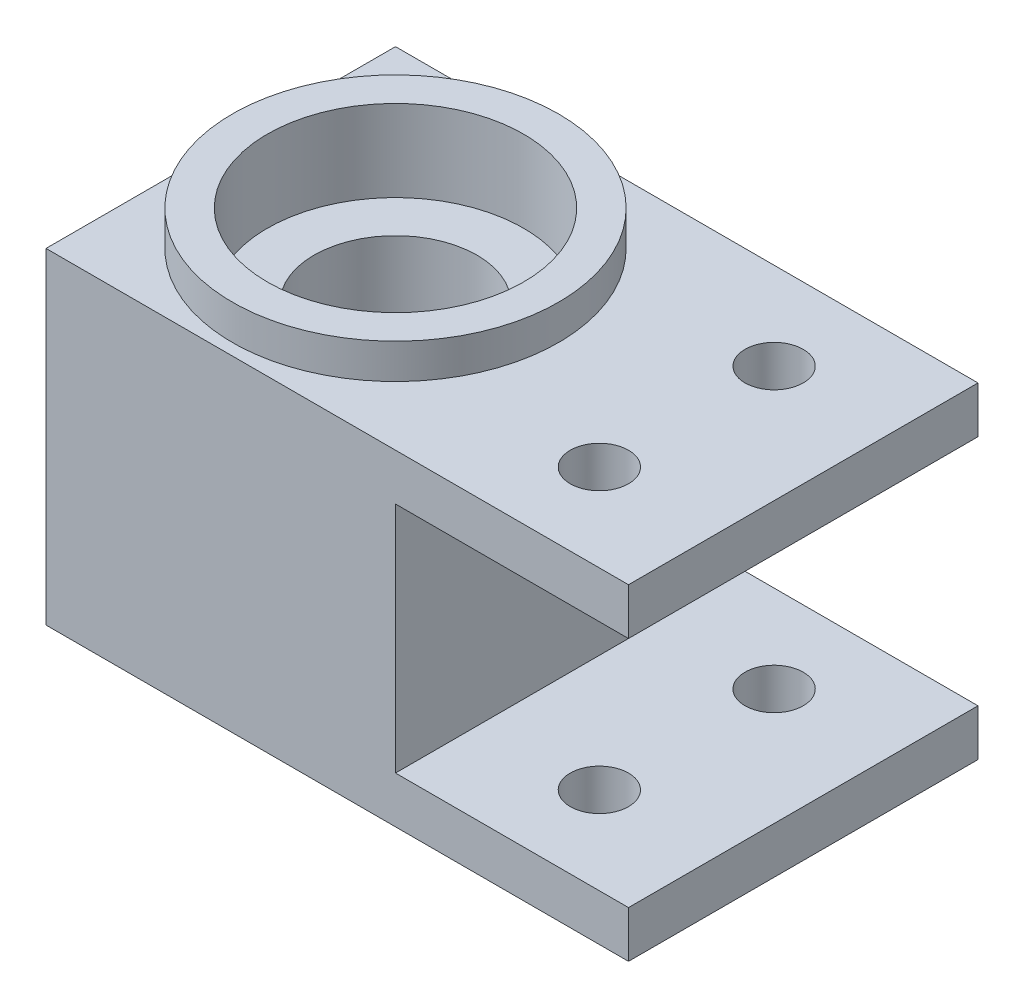
ISO-10303-21;
HEADER;
FILE_DESCRIPTION(('STEP AP214'),'2;1');
FILE_NAME('part.step','',(''),(''),'','','');
FILE_SCHEMA(('AUTOMOTIVE_DESIGN { 1 0 10303 214 1 1 1 1 }'));
ENDSEC;
DATA;
#1=APPLICATION_CONTEXT('core data for automotive mechanical design processes');
#2=APPLICATION_PROTOCOL_DEFINITION('international standard','automotive_design',2000,#1);
#3=PRODUCT_CONTEXT('',#1,'mechanical');
#4=PRODUCT('Part','Part','',(#3));
#5=PRODUCT_RELATED_PRODUCT_CATEGORY('part','',(#4));
#6=PRODUCT_DEFINITION_FORMATION('','',#4);
#7=PRODUCT_DEFINITION_CONTEXT('part definition',#1,'design');
#8=PRODUCT_DEFINITION('design','',#6,#7);
#9=PRODUCT_DEFINITION_SHAPE('','',#8);
#10=(LENGTH_UNIT() NAMED_UNIT(*) SI_UNIT(.MILLI.,.METRE.));
#11=(NAMED_UNIT(*) PLANE_ANGLE_UNIT() SI_UNIT($,.RADIAN.));
#12=(NAMED_UNIT(*) SI_UNIT($,.STERADIAN.) SOLID_ANGLE_UNIT());
#13=UNCERTAINTY_MEASURE_WITH_UNIT(LENGTH_MEASURE(1.E-05),#10,'distance_accuracy_value','');
#14=(GEOMETRIC_REPRESENTATION_CONTEXT(3) GLOBAL_UNCERTAINTY_ASSIGNED_CONTEXT((#13)) GLOBAL_UNIT_ASSIGNED_CONTEXT((#10,
#11,#12)) REPRESENTATION_CONTEXT('',''));
#15=CARTESIAN_POINT('',(0.,0.,0.));
#16=DIRECTION('',(0.,0.,1.));
#17=DIRECTION('',(1.,0.,0.));
#18=AXIS2_PLACEMENT_3D('',#15,#16,#17);
#19=CARTESIAN_POINT('',(10.,-14.,30.));
#20=DIRECTION('',(1.,0.,0.));
#21=DIRECTION('',(0.,0.,-1.));
#22=AXIS2_PLACEMENT_3D('',#19,#20,#21);
#23=PLANE('',#22);
#24=DIRECTION('',(0.,0.,-1.));
#25=VECTOR('',#24,1.);
#26=CARTESIAN_POINT('',(10.,10.,30.));
#27=LINE('',#26,#25);
#28=CARTESIAN_POINT('',(10.,10.,30.));
#29=VERTEX_POINT('',#28);
#30=CARTESIAN_POINT('',(10.,10.,0.));
#31=VERTEX_POINT('',#30);
#32=EDGE_CURVE('E115',#29,#31,#27,.T.);
#33=ORIENTED_EDGE('',*,*,#32,.T.);
#34=DIRECTION('',(0.,1.,0.));
#35=VECTOR('',#34,1.);
#36=CARTESIAN_POINT('',(10.,-14.,0.));
#37=LINE('',#36,#35);
#38=CARTESIAN_POINT('',(10.,14.,0.));
#39=VERTEX_POINT('',#38);
#40=EDGE_CURVE('E142',#31,#39,#37,.T.);
#41=ORIENTED_EDGE('',*,*,#40,.T.);
#42=DIRECTION('',(0.,0.,-1.));
#43=VECTOR('',#42,1.);
#44=CARTESIAN_POINT('',(10.,14.,30.));
#45=LINE('',#44,#43);
#46=CARTESIAN_POINT('',(10.,14.,30.));
#47=VERTEX_POINT('',#46);
#48=EDGE_CURVE('E132',#47,#39,#45,.T.);
#49=ORIENTED_EDGE('',*,*,#48,.F.);
#50=DIRECTION('',(0.,1.,0.));
#51=VECTOR('',#50,1.);
#52=CARTESIAN_POINT('',(10.,-14.,30.));
#53=LINE('',#52,#51);
#54=EDGE_CURVE('E48',#29,#47,#53,.T.);
#55=ORIENTED_EDGE('',*,*,#54,.F.);
#56=EDGE_LOOP('',(#33,#41,#49,#55));
#57=FACE_BOUND('',#56,.T.);
#58=ADVANCED_FACE('F39',(#57),#23,.T.);
#59=DIRECTION('',(0.,0.,-1.));
#60=VECTOR('',#59,1.);
#61=CARTESIAN_POINT('',(10.,-10.,30.));
#62=LINE('',#61,#60);
#63=CARTESIAN_POINT('',(10.,-10.,30.));
#64=VERTEX_POINT('',#63);
#65=CARTESIAN_POINT('',(10.,-10.,0.));
#66=VERTEX_POINT('',#65);
#67=EDGE_CURVE('E56',#64,#66,#62,.T.);
#68=ORIENTED_EDGE('',*,*,#67,.F.);
#69=CARTESIAN_POINT('',(10.,-14.,30.));
#70=VERTEX_POINT('',#69);
#71=EDGE_CURVE('E11',#70,#64,#53,.T.);
#72=ORIENTED_EDGE('',*,*,#71,.F.);
#73=DIRECTION('',(0.,0.,-1.));
#74=VECTOR('',#73,1.);
#75=CARTESIAN_POINT('',(10.,-14.,30.));
#76=LINE('',#75,#74);
#77=CARTESIAN_POINT('',(10.,-14.,0.));
#78=VERTEX_POINT('',#77);
#79=EDGE_CURVE('E160',#70,#78,#76,.T.);
#80=ORIENTED_EDGE('',*,*,#79,.T.);
#81=EDGE_CURVE('E43',#78,#66,#37,.T.);
#82=ORIENTED_EDGE('',*,*,#81,.T.);
#83=EDGE_LOOP('',(#68,#72,#80,#82));
#84=FACE_BOUND('',#83,.T.);
#85=ADVANCED_FACE('F41',(#84),#23,.T.);
#86=CARTESIAN_POINT('',(-40.,-14.,30.));
#87=DIRECTION('',(0.,0.,1.));
#88=DIRECTION('',(1.,0.,0.));
#89=AXIS2_PLACEMENT_3D('',#86,#87,#88);
#90=PLANE('',#89);
#91=DIRECTION('',(1.,0.,0.));
#92=VECTOR('',#91,1.);
#93=CARTESIAN_POINT('',(-10.,10.,30.));
#94=LINE('',#93,#92);
#95=CARTESIAN_POINT('',(-10.,10.,30.));
#96=VERTEX_POINT('',#95);
#97=EDGE_CURVE('E117',#96,#29,#94,.T.);
#98=ORIENTED_EDGE('',*,*,#97,.T.);
#99=ORIENTED_EDGE('',*,*,#54,.T.);
#100=DIRECTION('',(1.,0.,0.));
#101=VECTOR('',#100,1.);
#102=CARTESIAN_POINT('',(-40.,14.,30.));
#103=LINE('',#102,#101);
#104=CARTESIAN_POINT('',(-40.,14.,30.));
#105=VERTEX_POINT('',#104);
#106=EDGE_CURVE('E138',#105,#47,#103,.T.);
#107=ORIENTED_EDGE('',*,*,#106,.F.);
#108=DIRECTION('',(0.,1.,0.));
#109=VECTOR('',#108,1.);
#110=CARTESIAN_POINT('',(-40.,-14.,30.));
#111=LINE('',#110,#109);
#112=CARTESIAN_POINT('',(-40.,-14.,30.));
#113=VERTEX_POINT('',#112);
#114=EDGE_CURVE('E134',#113,#105,#111,.T.);
#115=ORIENTED_EDGE('',*,*,#114,.F.);
#116=DIRECTION('',(1.,0.,0.));
#117=VECTOR('',#116,1.);
#118=CARTESIAN_POINT('',(-40.,-14.,30.));
#119=LINE('',#118,#117);
#120=EDGE_CURVE('E143',#113,#70,#119,.T.);
#121=ORIENTED_EDGE('',*,*,#120,.T.);
#122=ORIENTED_EDGE('',*,*,#71,.T.);
#123=DIRECTION('',(-1.,0.,0.));
#124=VECTOR('',#123,1.);
#125=CARTESIAN_POINT('',(10.,-10.,30.));
#126=LINE('',#125,#124);
#127=CARTESIAN_POINT('',(-10.,-10.,30.));
#128=VERTEX_POINT('',#127);
#129=EDGE_CURVE('E128',#64,#128,#126,.T.);
#130=ORIENTED_EDGE('',*,*,#129,.T.);
#131=DIRECTION('',(0.,1.,0.));
#132=VECTOR('',#131,1.);
#133=CARTESIAN_POINT('',(-10.,-10.,30.));
#134=LINE('',#133,#132);
#135=EDGE_CURVE('E123',#128,#96,#134,.T.);
#136=ORIENTED_EDGE('',*,*,#135,.T.);
#137=EDGE_LOOP('',(#98,#99,#107,#115,#121,#122,#130,#136));
#138=FACE_BOUND('',#137,.T.);
#139=ADVANCED_FACE('F125',(#138),#90,.T.);
#140=CARTESIAN_POINT('',(-40.,-14.,0.));
#141=DIRECTION('',(-1.,0.,0.));
#142=DIRECTION('',(0.,0.,1.));
#143=AXIS2_PLACEMENT_3D('',#140,#141,#142);
#144=PLANE('',#143);
#145=DIRECTION('',(0.,0.,1.));
#146=VECTOR('',#145,1.);
#147=CARTESIAN_POINT('',(-40.,14.,0.));
#148=LINE('',#147,#146);
#149=CARTESIAN_POINT('',(-40.,14.,0.));
#150=VERTEX_POINT('',#149);
#151=EDGE_CURVE('E157',#150,#105,#148,.T.);
#152=ORIENTED_EDGE('',*,*,#151,.F.);
#153=DIRECTION('',(0.,1.,0.));
#154=VECTOR('',#153,1.);
#155=CARTESIAN_POINT('',(-40.,-14.,0.));
#156=LINE('',#155,#154);
#157=CARTESIAN_POINT('',(-40.,-14.,0.));
#158=VERTEX_POINT('',#157);
#159=EDGE_CURVE('E135',#158,#150,#156,.T.);
#160=ORIENTED_EDGE('',*,*,#159,.F.);
#161=DIRECTION('',(0.,0.,1.));
#162=VECTOR('',#161,1.);
#163=CARTESIAN_POINT('',(-40.,-14.,0.));
#164=LINE('',#163,#162);
#165=EDGE_CURVE('E145',#158,#113,#164,.T.);
#166=ORIENTED_EDGE('',*,*,#165,.T.);
#167=ORIENTED_EDGE('',*,*,#114,.T.);
#168=EDGE_LOOP('',(#152,#160,#166,#167));
#169=FACE_BOUND('',#168,.T.);
#170=ADVANCED_FACE('F239',(#169),#144,.T.);
#171=CARTESIAN_POINT('',(10.,-14.,0.));
#172=DIRECTION('',(0.,0.,-1.));
#173=DIRECTION('',(-1.,0.,0.));
#174=AXIS2_PLACEMENT_3D('',#171,#172,#173);
#175=PLANE('',#174);
#176=DIRECTION('',(1.,0.,0.));
#177=VECTOR('',#176,1.);
#178=CARTESIAN_POINT('',(-10.,10.,0.));
#179=LINE('',#178,#177);
#180=CARTESIAN_POINT('',(-10.,10.,0.));
#181=VERTEX_POINT('',#180);
#182=EDGE_CURVE('E120',#181,#31,#179,.T.);
#183=ORIENTED_EDGE('',*,*,#182,.F.);
#184=DIRECTION('',(0.,1.,0.));
#185=VECTOR('',#184,1.);
#186=CARTESIAN_POINT('',(-10.,-10.,0.));
#187=LINE('',#186,#185);
#188=CARTESIAN_POINT('',(-10.,-10.,0.));
#189=VERTEX_POINT('',#188);
#190=EDGE_CURVE('E129',#189,#181,#187,.T.);
#191=ORIENTED_EDGE('',*,*,#190,.F.);
#192=DIRECTION('',(-1.,0.,0.));
#193=VECTOR('',#192,1.);
#194=CARTESIAN_POINT('',(10.,-10.,0.));
#195=LINE('',#194,#193);
#196=EDGE_CURVE('E169',#66,#189,#195,.T.);
#197=ORIENTED_EDGE('',*,*,#196,.F.);
#198=ORIENTED_EDGE('',*,*,#81,.F.);
#199=DIRECTION('',(-1.,0.,0.));
#200=VECTOR('',#199,1.);
#201=CARTESIAN_POINT('',(10.,-14.,0.));
#202=LINE('',#201,#200);
#203=EDGE_CURVE('E149',#78,#158,#202,.T.);
#204=ORIENTED_EDGE('',*,*,#203,.T.);
#205=ORIENTED_EDGE('',*,*,#159,.T.);
#206=DIRECTION('',(-1.,0.,0.));
#207=VECTOR('',#206,1.);
#208=CARTESIAN_POINT('',(10.,14.,0.));
#209=LINE('',#208,#207);
#210=EDGE_CURVE('E154',#39,#150,#209,.T.);
#211=ORIENTED_EDGE('',*,*,#210,.F.);
#212=ORIENTED_EDGE('',*,*,#40,.F.);
#213=EDGE_LOOP('',(#183,#191,#197,#198,#204,#205,#211,#212));
#214=FACE_BOUND('',#213,.T.);
#215=ADVANCED_FACE('F230',(#214),#175,.T.);
#216=CARTESIAN_POINT('',(0.,-14.,0.));
#217=DIRECTION('',(0.,1.,0.));
#218=DIRECTION('',(0.,0.,1.));
#219=AXIS2_PLACEMENT_3D('',#216,#217,#218);
#220=PLANE('',#219);
#221=CARTESIAN_POINT('',(0.,-14.,7.5));
#222=DIRECTION('',(0.,-1.,0.));
#223=DIRECTION('',(0.,0.,-1.));
#224=AXIS2_PLACEMENT_3D('',#221,#222,#223);
#225=CIRCLE('',#224,2.49999999999999);
#226=CARTESIAN_POINT('',(0.,-14.,5.00000000000001));
#227=VERTEX_POINT('',#226);
#228=EDGE_CURVE('E219',#227,#227,#225,.T.);
#229=ORIENTED_EDGE('',*,*,#228,.F.);
#230=EDGE_LOOP('',(#229));
#231=FACE_BOUND('',#230,.T.);
#232=CARTESIAN_POINT('',(0.,-14.,22.5));
#233=DIRECTION('',(0.,-1.,0.));
#234=DIRECTION('',(0.,0.,-1.));
#235=AXIS2_PLACEMENT_3D('',#232,#233,#234);
#236=CIRCLE('',#235,2.49999999999999);
#237=CARTESIAN_POINT('',(0.,-14.,20.));
#238=VERTEX_POINT('',#237);
#239=EDGE_CURVE('E213',#238,#238,#236,.T.);
#240=ORIENTED_EDGE('',*,*,#239,.F.);
#241=EDGE_LOOP('',(#240));
#242=FACE_BOUND('',#241,.T.);
#243=CARTESIAN_POINT('',(-25.,-14.,15.));
#244=DIRECTION('',(0.,1.,0.));
#245=DIRECTION('',(0.,0.,1.));
#246=AXIS2_PLACEMENT_3D('',#243,#244,#245);
#247=CIRCLE('',#246,11.);
#248=CARTESIAN_POINT('',(-25.,-14.,26.));
#249=VERTEX_POINT('',#248);
#250=EDGE_CURVE('E180',#249,#249,#247,.T.);
#251=ORIENTED_EDGE('',*,*,#250,.T.);
#252=EDGE_LOOP('',(#251));
#253=FACE_BOUND('',#252,.T.);
#254=ORIENTED_EDGE('',*,*,#79,.F.);
#255=ORIENTED_EDGE('',*,*,#120,.F.);
#256=ORIENTED_EDGE('',*,*,#165,.F.);
#257=ORIENTED_EDGE('',*,*,#203,.F.);
#258=EDGE_LOOP('',(#254,#255,#256,#257));
#259=FACE_BOUND('',#258,.T.);
#260=ADVANCED_FACE('F226',(#231,#242,#253,#259),#220,.F.);
#261=CARTESIAN_POINT('',(0.,14.,0.));
#262=DIRECTION('',(0.,1.,0.));
#263=DIRECTION('',(0.,0.,1.));
#264=AXIS2_PLACEMENT_3D('',#261,#262,#263);
#265=PLANE('',#264);
#266=CARTESIAN_POINT('',(0.,14.,7.5));
#267=DIRECTION('',(0.,1.,0.));
#268=DIRECTION('',(0.,0.,1.));
#269=AXIS2_PLACEMENT_3D('',#266,#267,#268);
#270=CIRCLE('',#269,2.49999999999999);
#271=CARTESIAN_POINT('',(0.,14.,9.99999999999999));
#272=VERTEX_POINT('',#271);
#273=EDGE_CURVE('E204',#272,#272,#270,.T.);
#274=ORIENTED_EDGE('',*,*,#273,.F.);
#275=EDGE_LOOP('',(#274));
#276=FACE_BOUND('',#275,.T.);
#277=CARTESIAN_POINT('',(0.,14.,22.5));
#278=DIRECTION('',(0.,1.,0.));
#279=DIRECTION('',(0.,0.,1.));
#280=AXIS2_PLACEMENT_3D('',#277,#278,#279);
#281=CIRCLE('',#280,2.49999999999999);
#282=CARTESIAN_POINT('',(0.,14.,25.));
#283=VERTEX_POINT('',#282);
#284=EDGE_CURVE('E198',#283,#283,#281,.T.);
#285=ORIENTED_EDGE('',*,*,#284,.F.);
#286=EDGE_LOOP('',(#285));
#287=FACE_BOUND('',#286,.T.);
#288=CARTESIAN_POINT('',(-25.,14.,15.));
#289=DIRECTION('',(0.,-1.,0.));
#290=DIRECTION('',(0.,0.,-1.));
#291=AXIS2_PLACEMENT_3D('',#288,#289,#290);
#292=CIRCLE('',#291,14.);
#293=CARTESIAN_POINT('',(-25.,14.,1.));
#294=VERTEX_POINT('',#293);
#295=EDGE_CURVE('E177',#294,#294,#292,.T.);
#296=ORIENTED_EDGE('',*,*,#295,.T.);
#297=EDGE_LOOP('',(#296));
#298=FACE_BOUND('',#297,.T.);
#299=ORIENTED_EDGE('',*,*,#48,.T.);
#300=ORIENTED_EDGE('',*,*,#210,.T.);
#301=ORIENTED_EDGE('',*,*,#151,.T.);
#302=ORIENTED_EDGE('',*,*,#106,.T.);
#303=EDGE_LOOP('',(#299,#300,#301,#302));
#304=FACE_BOUND('',#303,.T.);
#305=ADVANCED_FACE('F229',(#276,#287,#298,#304),#265,.T.);
#306=CARTESIAN_POINT('',(-10.,10.,30.));
#307=DIRECTION('',(0.,1.,0.));
#308=DIRECTION('',(0.,0.,1.));
#309=AXIS2_PLACEMENT_3D('',#306,#307,#308);
#310=PLANE('',#309);
#311=CARTESIAN_POINT('',(0.,10.,7.5));
#312=DIRECTION('',(0.,-1.,0.));
#313=DIRECTION('',(0.,0.,-1.));
#314=AXIS2_PLACEMENT_3D('',#311,#312,#313);
#315=CIRCLE('',#314,2.49999999999999);
#316=CARTESIAN_POINT('',(0.,10.,5.00000000000001));
#317=VERTEX_POINT('',#316);
#318=EDGE_CURVE('E207',#317,#317,#315,.T.);
#319=ORIENTED_EDGE('',*,*,#318,.F.);
#320=EDGE_LOOP('',(#319));
#321=FACE_BOUND('',#320,.T.);
#322=CARTESIAN_POINT('',(0.,10.,22.5));
#323=DIRECTION('',(0.,-1.,0.));
#324=DIRECTION('',(0.,0.,-1.));
#325=AXIS2_PLACEMENT_3D('',#322,#323,#324);
#326=CIRCLE('',#325,2.49999999999999);
#327=CARTESIAN_POINT('',(0.,10.,20.));
#328=VERTEX_POINT('',#327);
#329=EDGE_CURVE('E201',#328,#328,#326,.T.);
#330=ORIENTED_EDGE('',*,*,#329,.F.);
#331=EDGE_LOOP('',(#330));
#332=FACE_BOUND('',#331,.T.);
#333=ORIENTED_EDGE('',*,*,#182,.T.);
#334=ORIENTED_EDGE('',*,*,#32,.F.);
#335=ORIENTED_EDGE('',*,*,#97,.F.);
#336=DIRECTION('',(0.,0.,-1.));
#337=VECTOR('',#336,1.);
#338=CARTESIAN_POINT('',(-10.,10.,30.));
#339=LINE('',#338,#337);
#340=EDGE_CURVE('E155',#96,#181,#339,.T.);
#341=ORIENTED_EDGE('',*,*,#340,.T.);
#342=EDGE_LOOP('',(#333,#334,#335,#341));
#343=FACE_BOUND('',#342,.T.);
#344=ADVANCED_FACE('F116',(#321,#332,#343),#310,.F.);
#345=CARTESIAN_POINT('',(-10.,-10.,30.));
#346=DIRECTION('',(-1.,0.,0.));
#347=DIRECTION('',(0.,0.,1.));
#348=AXIS2_PLACEMENT_3D('',#345,#346,#347);
#349=PLANE('',#348);
#350=ORIENTED_EDGE('',*,*,#190,.T.);
#351=ORIENTED_EDGE('',*,*,#340,.F.);
#352=ORIENTED_EDGE('',*,*,#135,.F.);
#353=DIRECTION('',(0.,0.,-1.));
#354=VECTOR('',#353,1.);
#355=CARTESIAN_POINT('',(-10.,-10.,30.));
#356=LINE('',#355,#354);
#357=EDGE_CURVE('E164',#128,#189,#356,.T.);
#358=ORIENTED_EDGE('',*,*,#357,.T.);
#359=EDGE_LOOP('',(#350,#351,#352,#358));
#360=FACE_BOUND('',#359,.T.);
#361=ADVANCED_FACE('F255',(#360),#349,.F.);
#362=CARTESIAN_POINT('',(10.,-10.,30.));
#363=DIRECTION('',(0.,-1.,0.));
#364=DIRECTION('',(0.,0.,-1.));
#365=AXIS2_PLACEMENT_3D('',#362,#363,#364);
#366=PLANE('',#365);
#367=CARTESIAN_POINT('',(0.,-10.,7.5));
#368=DIRECTION('',(0.,-1.,0.));
#369=DIRECTION('',(0.,0.,-1.));
#370=AXIS2_PLACEMENT_3D('',#367,#368,#369);
#371=CIRCLE('',#370,2.49999999999999);
#372=CARTESIAN_POINT('',(0.,-10.,5.00000000000001));
#373=VERTEX_POINT('',#372);
#374=EDGE_CURVE('E216',#373,#373,#371,.T.);
#375=ORIENTED_EDGE('',*,*,#374,.T.);
#376=EDGE_LOOP('',(#375));
#377=FACE_BOUND('',#376,.T.);
#378=CARTESIAN_POINT('',(0.,-10.,22.5));
#379=DIRECTION('',(0.,-1.,0.));
#380=DIRECTION('',(0.,0.,-1.));
#381=AXIS2_PLACEMENT_3D('',#378,#379,#380);
#382=CIRCLE('',#381,2.49999999999999);
#383=CARTESIAN_POINT('',(0.,-10.,20.));
#384=VERTEX_POINT('',#383);
#385=EDGE_CURVE('E210',#384,#384,#382,.T.);
#386=ORIENTED_EDGE('',*,*,#385,.T.);
#387=EDGE_LOOP('',(#386));
#388=FACE_BOUND('',#387,.T.);
#389=ORIENTED_EDGE('',*,*,#196,.T.);
#390=ORIENTED_EDGE('',*,*,#357,.F.);
#391=ORIENTED_EDGE('',*,*,#129,.F.);
#392=ORIENTED_EDGE('',*,*,#67,.T.);
#393=EDGE_LOOP('',(#389,#390,#391,#392));
#394=FACE_BOUND('',#393,.T.);
#395=ADVANCED_FACE('F253',(#377,#388,#394),#366,.F.);
#396=CARTESIAN_POINT('',(-25.,17.,15.));
#397=DIRECTION('',(0.,-1.,0.));
#398=DIRECTION('',(0.,0.,-1.));
#399=AXIS2_PLACEMENT_3D('',#396,#397,#398);
#400=CYLINDRICAL_SURFACE('',#399,14.);
#401=CARTESIAN_POINT('',(-25.,17.,15.));
#402=DIRECTION('',(0.,-1.,0.));
#403=DIRECTION('',(0.,0.,-1.));
#404=AXIS2_PLACEMENT_3D('',#401,#402,#403);
#405=CIRCLE('',#404,14.);
#406=CARTESIAN_POINT('',(-25.,17.,0.999999999999999));
#407=VERTEX_POINT('',#406);
#408=EDGE_CURVE('E172',#407,#407,#405,.T.);
#409=ORIENTED_EDGE('',*,*,#408,.T.);
#410=EDGE_LOOP('',(#409));
#411=FACE_BOUND('',#410,.T.);
#412=ORIENTED_EDGE('',*,*,#295,.F.);
#413=EDGE_LOOP('',(#412));
#414=FACE_BOUND('',#413,.T.);
#415=ADVANCED_FACE('F262',(#411,#414),#400,.T.);
#416=CARTESIAN_POINT('',(-11.,17.,15.));
#417=DIRECTION('',(0.,1.,0.));
#418=DIRECTION('',(0.,0.,1.));
#419=AXIS2_PLACEMENT_3D('',#416,#417,#418);
#420=PLANE('',#419);
#421=CARTESIAN_POINT('',(-25.,17.,15.));
#422=DIRECTION('',(0.,1.,0.));
#423=DIRECTION('',(0.,0.,1.));
#424=AXIS2_PLACEMENT_3D('',#421,#422,#423);
#425=CIRCLE('',#424,11.);
#426=CARTESIAN_POINT('',(-25.,17.,26.));
#427=VERTEX_POINT('',#426);
#428=EDGE_CURVE('E183',#427,#427,#425,.T.);
#429=ORIENTED_EDGE('',*,*,#428,.F.);
#430=EDGE_LOOP('',(#429));
#431=FACE_BOUND('',#430,.T.);
#432=ORIENTED_EDGE('',*,*,#408,.F.);
#433=EDGE_LOOP('',(#432));
#434=FACE_BOUND('',#433,.T.);
#435=ADVANCED_FACE('F281',(#431,#434),#420,.T.);
#436=CARTESIAN_POINT('',(-25.,-14.,15.));
#437=DIRECTION('',(0.,1.,0.));
#438=DIRECTION('',(0.,0.,1.));
#439=AXIS2_PLACEMENT_3D('',#436,#437,#438);
#440=CYLINDRICAL_SURFACE('',#439,11.);
#441=ORIENTED_EDGE('',*,*,#250,.F.);
#442=EDGE_LOOP('',(#441));
#443=FACE_BOUND('',#442,.T.);
#444=CARTESIAN_POINT('',(-25.,-7.,15.));
#445=DIRECTION('',(0.,1.,0.));
#446=DIRECTION('',(0.,0.,1.));
#447=AXIS2_PLACEMENT_3D('',#444,#445,#446);
#448=CIRCLE('',#447,11.);
#449=CARTESIAN_POINT('',(-25.,-7.,26.));
#450=VERTEX_POINT('',#449);
#451=EDGE_CURVE('E195',#450,#450,#448,.T.);
#452=ORIENTED_EDGE('',*,*,#451,.T.);
#453=EDGE_LOOP('',(#452));
#454=FACE_BOUND('',#453,.T.);
#455=ADVANCED_FACE('F286',(#443,#454),#440,.F.);
#456=CARTESIAN_POINT('',(-25.,-14.,15.));
#457=DIRECTION('',(0.,1.,0.));
#458=DIRECTION('',(0.,0.,1.));
#459=AXIS2_PLACEMENT_3D('',#456,#457,#458);
#460=CYLINDRICAL_SURFACE('',#459,11.);
#461=CARTESIAN_POINT('',(-25.,10.,15.));
#462=DIRECTION('',(0.,1.,0.));
#463=DIRECTION('',(0.,0.,1.));
#464=AXIS2_PLACEMENT_3D('',#461,#462,#463);
#465=CIRCLE('',#464,11.);
#466=CARTESIAN_POINT('',(-25.,10.,26.));
#467=VERTEX_POINT('',#466);
#468=EDGE_CURVE('E186',#467,#467,#465,.T.);
#469=ORIENTED_EDGE('',*,*,#468,.F.);
#470=EDGE_LOOP('',(#469));
#471=FACE_BOUND('',#470,.T.);
#472=ORIENTED_EDGE('',*,*,#428,.T.);
#473=EDGE_LOOP('',(#472));
#474=FACE_BOUND('',#473,.T.);
#475=ADVANCED_FACE('F293',(#471,#474),#460,.F.);
#476=CARTESIAN_POINT('',(-14.,10.,15.));
#477=DIRECTION('',(0.,-1.,0.));
#478=DIRECTION('',(0.,0.,-1.));
#479=AXIS2_PLACEMENT_3D('',#476,#477,#478);
#480=PLANE('',#479);
#481=CARTESIAN_POINT('',(-25.,10.,15.));
#482=DIRECTION('',(0.,1.,0.));
#483=DIRECTION('',(0.,0.,1.));
#484=AXIS2_PLACEMENT_3D('',#481,#482,#483);
#485=CIRCLE('',#484,7.);
#486=CARTESIAN_POINT('',(-25.,10.,22.));
#487=VERTEX_POINT('',#486);
#488=EDGE_CURVE('E189',#487,#487,#485,.T.);
#489=ORIENTED_EDGE('',*,*,#488,.F.);
#490=EDGE_LOOP('',(#489));
#491=FACE_BOUND('',#490,.T.);
#492=ORIENTED_EDGE('',*,*,#468,.T.);
#493=EDGE_LOOP('',(#492));
#494=FACE_BOUND('',#493,.T.);
#495=ADVANCED_FACE('F300',(#491,#494),#480,.F.);
#496=CARTESIAN_POINT('',(-25.,-14.,15.));
#497=DIRECTION('',(0.,1.,0.));
#498=DIRECTION('',(0.,0.,1.));
#499=AXIS2_PLACEMENT_3D('',#496,#497,#498);
#500=CYLINDRICAL_SURFACE('',#499,7.);
#501=CARTESIAN_POINT('',(-25.,-7.,15.));
#502=DIRECTION('',(0.,1.,0.));
#503=DIRECTION('',(0.,0.,1.));
#504=AXIS2_PLACEMENT_3D('',#501,#502,#503);
#505=CIRCLE('',#504,7.);
#506=CARTESIAN_POINT('',(-25.,-7.,22.));
#507=VERTEX_POINT('',#506);
#508=EDGE_CURVE('E192',#507,#507,#505,.T.);
#509=ORIENTED_EDGE('',*,*,#508,.F.);
#510=EDGE_LOOP('',(#509));
#511=FACE_BOUND('',#510,.T.);
#512=ORIENTED_EDGE('',*,*,#488,.T.);
#513=EDGE_LOOP('',(#512));
#514=FACE_BOUND('',#513,.T.);
#515=ADVANCED_FACE('F304',(#511,#514),#500,.F.);
#516=CARTESIAN_POINT('',(-18.,-7.,15.));
#517=DIRECTION('',(0.,1.,0.));
#518=DIRECTION('',(0.,0.,1.));
#519=AXIS2_PLACEMENT_3D('',#516,#517,#518);
#520=PLANE('',#519);
#521=ORIENTED_EDGE('',*,*,#451,.F.);
#522=EDGE_LOOP('',(#521));
#523=FACE_BOUND('',#522,.T.);
#524=ORIENTED_EDGE('',*,*,#508,.T.);
#525=EDGE_LOOP('',(#524));
#526=FACE_BOUND('',#525,.T.);
#527=ADVANCED_FACE('F308',(#523,#526),#520,.F.);
#528=CARTESIAN_POINT('',(0.,10.,22.5));
#529=DIRECTION('',(0.,-1.,0.));
#530=DIRECTION('',(0.,0.,-1.));
#531=AXIS2_PLACEMENT_3D('',#528,#529,#530);
#532=CYLINDRICAL_SURFACE('',#531,2.49999999999999);
#533=ORIENTED_EDGE('',*,*,#284,.T.);
#534=EDGE_LOOP('',(#533));
#535=FACE_BOUND('',#534,.T.);
#536=ORIENTED_EDGE('',*,*,#329,.T.);
#537=EDGE_LOOP('',(#536));
#538=FACE_BOUND('',#537,.T.);
#539=ADVANCED_FACE('F312',(#535,#538),#532,.F.);
#540=CARTESIAN_POINT('',(0.,10.,7.5));
#541=DIRECTION('',(0.,-1.,0.));
#542=DIRECTION('',(0.,0.,-1.));
#543=AXIS2_PLACEMENT_3D('',#540,#541,#542);
#544=CYLINDRICAL_SURFACE('',#543,2.49999999999999);
#545=ORIENTED_EDGE('',*,*,#273,.T.);
#546=EDGE_LOOP('',(#545));
#547=FACE_BOUND('',#546,.T.);
#548=ORIENTED_EDGE('',*,*,#318,.T.);
#549=EDGE_LOOP('',(#548));
#550=FACE_BOUND('',#549,.T.);
#551=ADVANCED_FACE('F316',(#547,#550),#544,.F.);
#552=CARTESIAN_POINT('',(0.,-14.,22.5));
#553=DIRECTION('',(0.,-1.,0.));
#554=DIRECTION('',(0.,0.,-1.));
#555=AXIS2_PLACEMENT_3D('',#552,#553,#554);
#556=CYLINDRICAL_SURFACE('',#555,2.49999999999999);
#557=ORIENTED_EDGE('',*,*,#239,.T.);
#558=EDGE_LOOP('',(#557));
#559=FACE_BOUND('',#558,.T.);
#560=ORIENTED_EDGE('',*,*,#385,.F.);
#561=EDGE_LOOP('',(#560));
#562=FACE_BOUND('',#561,.T.);
#563=ADVANCED_FACE('F320',(#559,#562),#556,.F.);
#564=CARTESIAN_POINT('',(0.,-14.,7.5));
#565=DIRECTION('',(0.,-1.,0.));
#566=DIRECTION('',(0.,0.,-1.));
#567=AXIS2_PLACEMENT_3D('',#564,#565,#566);
#568=CYLINDRICAL_SURFACE('',#567,2.49999999999999);
#569=ORIENTED_EDGE('',*,*,#228,.T.);
#570=EDGE_LOOP('',(#569));
#571=FACE_BOUND('',#570,.T.);
#572=ORIENTED_EDGE('',*,*,#374,.F.);
#573=EDGE_LOOP('',(#572));
#574=FACE_BOUND('',#573,.T.);
#575=ADVANCED_FACE('F223',(#571,#574),#568,.F.);
#576=CLOSED_SHELL('',(#58,#85,#139,#170,#215,#260,#305,#344,#361,#395,#415,#435,#455,#475,#495,
#515,#527,#539,#551,#563,#575));
#577=MANIFOLD_SOLID_BREP('B2',#576);
#578=ADVANCED_BREP_SHAPE_REPRESENTATION('',(#18,#577),#14);
#579=SHAPE_DEFINITION_REPRESENTATION(#9,#578);
ENDSEC;
END-ISO-10303-21;
